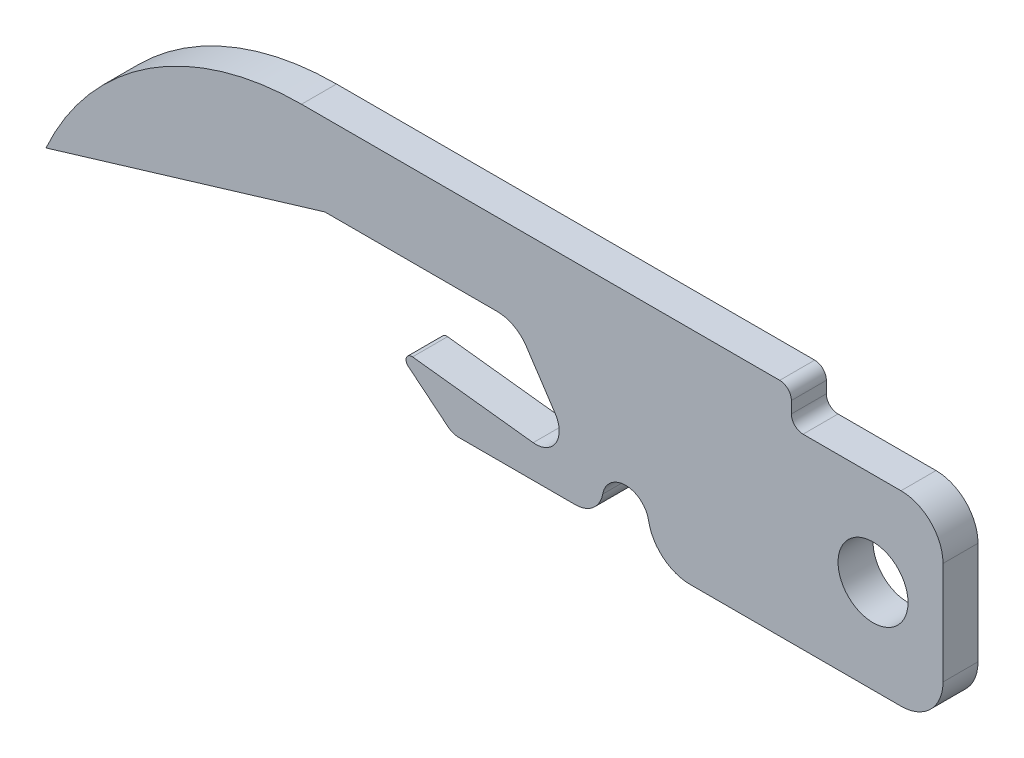
ISO-10303-21;
HEADER;
FILE_DESCRIPTION(('STEP AP214'),'2;1');
FILE_NAME('part.step','',(''),(''),'','','');
FILE_SCHEMA(('AUTOMOTIVE_DESIGN { 1 0 10303 214 1 1 1 1 }'));
ENDSEC;
DATA;
#1=APPLICATION_CONTEXT('core data for automotive mechanical design processes');
#2=APPLICATION_PROTOCOL_DEFINITION('international standard','automotive_design',2000,#1);
#3=PRODUCT_CONTEXT('',#1,'mechanical');
#4=PRODUCT('Part','Part','',(#3));
#5=PRODUCT_RELATED_PRODUCT_CATEGORY('part','',(#4));
#6=PRODUCT_DEFINITION_FORMATION('','',#4);
#7=PRODUCT_DEFINITION_CONTEXT('part definition',#1,'design');
#8=PRODUCT_DEFINITION('design','',#6,#7);
#9=PRODUCT_DEFINITION_SHAPE('','',#8);
#10=(LENGTH_UNIT() NAMED_UNIT(*) SI_UNIT(.MILLI.,.METRE.));
#11=(NAMED_UNIT(*) PLANE_ANGLE_UNIT() SI_UNIT($,.RADIAN.));
#12=(NAMED_UNIT(*) SI_UNIT($,.STERADIAN.) SOLID_ANGLE_UNIT());
#13=UNCERTAINTY_MEASURE_WITH_UNIT(LENGTH_MEASURE(1.E-05),#10,'distance_accuracy_value','');
#14=(GEOMETRIC_REPRESENTATION_CONTEXT(3) GLOBAL_UNCERTAINTY_ASSIGNED_CONTEXT((#13)) GLOBAL_UNIT_ASSIGNED_CONTEXT((#10,
#11,#12)) REPRESENTATION_CONTEXT('',''));
#15=CARTESIAN_POINT('',(0.,0.,0.));
#16=DIRECTION('',(0.,0.,1.));
#17=DIRECTION('',(1.,0.,0.));
#18=AXIS2_PLACEMENT_3D('',#15,#16,#17);
#19=CARTESIAN_POINT('',(0.494880788936604,4.26557798723639,0.75));
#20=DIRECTION('',(-0.115244285570749,-0.993337180741407,0.));
#21=DIRECTION('',(0.993337180741408,-0.115244285570749,0.));
#22=AXIS2_PLACEMENT_3D('',#19,#20,#21);
#23=PLANE('',#22);
#24=DIRECTION('',(-0.993337180741408,0.115244285570749,0.));
#25=VECTOR('',#24,1.);
#26=CARTESIAN_POINT('',(0.494880788936604,4.26557798723639,-0.75));
#27=LINE('',#26,#25);
#28=CARTESIAN_POINT('',(20.8847557144293,1.9,-0.75));
#29=VERTEX_POINT('',#28);
#30=CARTESIAN_POINT('',(15.7131126651177,2.5,-0.75));
#31=VERTEX_POINT('',#30);
#32=EDGE_CURVE('E220',#29,#31,#27,.T.);
#33=ORIENTED_EDGE('',*,*,#32,.T.);
#34=DIRECTION('',(0.,0.,-1.));
#35=VECTOR('',#34,1.);
#36=CARTESIAN_POINT('',(15.7131126651177,2.5,0.75));
#37=LINE('',#36,#35);
#38=CARTESIAN_POINT('',(15.7131126651177,2.5,0.75));
#39=VERTEX_POINT('',#38);
#40=EDGE_CURVE('E202',#39,#31,#37,.T.);
#41=ORIENTED_EDGE('',*,*,#40,.F.);
#42=DIRECTION('',(-0.993337180741408,0.115244285570749,0.));
#43=VECTOR('',#42,1.);
#44=CARTESIAN_POINT('',(0.494880788936604,4.26557798723639,0.75));
#45=LINE('',#44,#43);
#46=CARTESIAN_POINT('',(20.8847557144293,1.9,0.75));
#47=VERTEX_POINT('',#46);
#48=EDGE_CURVE('E208',#47,#39,#45,.T.);
#49=ORIENTED_EDGE('',*,*,#48,.F.);
#50=DIRECTION('',(0.,0.,-1.));
#51=VECTOR('',#50,1.);
#52=CARTESIAN_POINT('',(20.8847557144293,1.9,0.75));
#53=LINE('',#52,#51);
#54=EDGE_CURVE('E295',#47,#29,#53,.T.);
#55=ORIENTED_EDGE('',*,*,#54,.T.);
#56=EDGE_LOOP('',(#33,#41,#49,#55));
#57=FACE_BOUND('',#56,.T.);
#58=ADVANCED_FACE('F39',(#57),#23,.F.);
#59=CARTESIAN_POINT('',(15.684301593725,2.25166570481465,0.75));
#60=DIRECTION('',(0.,0.,-1.));
#61=DIRECTION('',(-1.,0.,0.));
#62=AXIS2_PLACEMENT_3D('',#59,#60,#61);
#63=CYLINDRICAL_SURFACE('',#62,0.25);
#64=CARTESIAN_POINT('',(15.684301593725,2.25166570481465,-0.75));
#65=DIRECTION('',(0.,0.,1.));
#66=DIRECTION('',(1.,0.,0.));
#67=AXIS2_PLACEMENT_3D('',#64,#65,#66);
#68=CIRCLE('',#67,0.25);
#69=CARTESIAN_POINT('',(15.5263961663952,2.05784652098655,-0.75));
#70=VERTEX_POINT('',#69);
#71=EDGE_CURVE('E344',#31,#70,#68,.T.);
#72=ORIENTED_EDGE('',*,*,#71,.T.);
#73=DIRECTION('',(0.,0.,-1.));
#74=VECTOR('',#73,1.);
#75=CARTESIAN_POINT('',(15.5263961663952,2.05784652098655,0.75));
#76=LINE('',#75,#74);
#77=CARTESIAN_POINT('',(15.5263961663952,2.05784652098655,0.75));
#78=VERTEX_POINT('',#77);
#79=EDGE_CURVE('E204',#78,#70,#76,.T.);
#80=ORIENTED_EDGE('',*,*,#79,.F.);
#81=CARTESIAN_POINT('',(15.684301593725,2.25166570481465,0.75));
#82=DIRECTION('',(0.,0.,1.));
#83=DIRECTION('',(1.,0.,0.));
#84=AXIS2_PLACEMENT_3D('',#81,#82,#83);
#85=CIRCLE('',#84,0.25);
#86=EDGE_CURVE('E197',#39,#78,#85,.T.);
#87=ORIENTED_EDGE('',*,*,#86,.F.);
#88=ORIENTED_EDGE('',*,*,#40,.T.);
#89=EDGE_LOOP('',(#72,#80,#87,#88));
#90=FACE_BOUND('',#89,.T.);
#91=ADVANCED_FACE('F200',(#90),#63,.T.);
#92=CARTESIAN_POINT('',(7.20188300308704,8.83986769351718,0.75));
#93=DIRECTION('',(-0.631621709319232,-0.775276735312399,0.));
#94=DIRECTION('',(0.775276735312399,-0.631621709319232,0.));
#95=AXIS2_PLACEMENT_3D('',#92,#93,#94);
#96=PLANE('',#95);
#97=DIRECTION('',(-0.775276735312399,0.631621709319232,0.));
#98=VECTOR('',#97,1.);
#99=CARTESIAN_POINT('',(7.20188300308704,8.83986769351718,-0.75));
#100=LINE('',#99,#98);
#101=CARTESIAN_POINT('',(17.2316813232691,0.668542448515701,-0.75));
#102=VERTEX_POINT('',#101);
#103=EDGE_CURVE('E342',#102,#70,#100,.T.);
#104=ORIENTED_EDGE('',*,*,#103,.F.);
#105=DIRECTION('',(0.,0.,-1.));
#106=VECTOR('',#105,1.);
#107=CARTESIAN_POINT('',(17.2316813232691,0.668542448515701,0.75));
#108=LINE('',#107,#106);
#109=CARTESIAN_POINT('',(17.2316813232691,0.668542448515701,0.75));
#110=VERTEX_POINT('',#109);
#111=EDGE_CURVE('E225',#110,#102,#108,.T.);
#112=ORIENTED_EDGE('',*,*,#111,.F.);
#113=DIRECTION('',(-0.775276735312399,0.631621709319232,0.));
#114=VECTOR('',#113,1.);
#115=CARTESIAN_POINT('',(7.20188300308704,8.83986769351718,0.75));
#116=LINE('',#115,#114);
#117=EDGE_CURVE('E207',#110,#78,#116,.T.);
#118=ORIENTED_EDGE('',*,*,#117,.T.);
#119=ORIENTED_EDGE('',*,*,#79,.T.);
#120=EDGE_LOOP('',(#104,#112,#118,#119));
#121=FACE_BOUND('',#120,.T.);
#122=ADVANCED_FACE('F343',(#121),#96,.T.);
#123=CARTESIAN_POINT('',(17.7053976052585,1.25,0.75));
#124=DIRECTION('',(0.,0.,-1.));
#125=DIRECTION('',(-1.,0.,0.));
#126=AXIS2_PLACEMENT_3D('',#123,#124,#125);
#127=CYLINDRICAL_SURFACE('',#126,0.75);
#128=CARTESIAN_POINT('',(17.7053976052585,1.25,-0.75));
#129=DIRECTION('',(0.,0.,1.));
#130=DIRECTION('',(1.,0.,0.));
#131=AXIS2_PLACEMENT_3D('',#128,#129,#130);
#132=CIRCLE('',#131,0.75);
#133=CARTESIAN_POINT('',(17.7053976052585,0.5,-0.75));
#134=VERTEX_POINT('',#133);
#135=EDGE_CURVE('E336',#134,#102,#132,.F.);
#136=ORIENTED_EDGE('',*,*,#135,.F.);
#137=DIRECTION('',(0.,0.,-1.));
#138=VECTOR('',#137,1.);
#139=CARTESIAN_POINT('',(17.7053976052585,0.5,0.75));
#140=LINE('',#139,#138);
#141=CARTESIAN_POINT('',(17.7053976052585,0.5,0.75));
#142=VERTEX_POINT('',#141);
#143=EDGE_CURVE('E329',#142,#134,#140,.T.);
#144=ORIENTED_EDGE('',*,*,#143,.F.);
#145=CARTESIAN_POINT('',(17.7053976052585,1.25,0.75));
#146=DIRECTION('',(0.,0.,1.));
#147=DIRECTION('',(1.,0.,0.));
#148=AXIS2_PLACEMENT_3D('',#145,#146,#147);
#149=CIRCLE('',#148,0.75);
#150=EDGE_CURVE('E339',#142,#110,#149,.F.);
#151=ORIENTED_EDGE('',*,*,#150,.T.);
#152=ORIENTED_EDGE('',*,*,#111,.T.);
#153=EDGE_LOOP('',(#136,#144,#151,#152));
#154=FACE_BOUND('',#153,.T.);
#155=ADVANCED_FACE('F334',(#154),#127,.T.);
#156=CARTESIAN_POINT('',(0.,0.499999999999995,0.75));
#157=DIRECTION('',(0.,-1.,0.));
#158=DIRECTION('',(1.,0.,0.));
#159=AXIS2_PLACEMENT_3D('',#156,#157,#158);
#160=PLANE('',#159);
#161=DIRECTION('',(-1.,0.,0.));
#162=VECTOR('',#161,1.);
#163=CARTESIAN_POINT('',(0.,0.499999999999995,-0.75));
#164=LINE('',#163,#162);
#165=CARTESIAN_POINT('',(22.6873607253505,0.500000000000001,-0.75));
#166=VERTEX_POINT('',#165);
#167=EDGE_CURVE('E348',#166,#134,#164,.T.);
#168=ORIENTED_EDGE('',*,*,#167,.F.);
#169=DIRECTION('',(0.,0.,-1.));
#170=VECTOR('',#169,1.);
#171=CARTESIAN_POINT('',(22.6873607253505,0.500000000000001,0.75));
#172=LINE('',#171,#170);
#173=CARTESIAN_POINT('',(22.6873607253505,0.500000000000001,0.75));
#174=VERTEX_POINT('',#173);
#175=EDGE_CURVE('E327',#174,#166,#172,.T.);
#176=ORIENTED_EDGE('',*,*,#175,.F.);
#177=DIRECTION('',(-1.,0.,0.));
#178=VECTOR('',#177,1.);
#179=CARTESIAN_POINT('',(0.,0.499999999999995,0.75));
#180=LINE('',#179,#178);
#181=EDGE_CURVE('E371',#174,#142,#180,.T.);
#182=ORIENTED_EDGE('',*,*,#181,.T.);
#183=ORIENTED_EDGE('',*,*,#143,.T.);
#184=EDGE_LOOP('',(#168,#176,#182,#183));
#185=FACE_BOUND('',#184,.T.);
#186=ADVANCED_FACE('F370',(#185),#160,.T.);
#187=CARTESIAN_POINT('',(22.6873607253505,1.69809038664018,0.75));
#188=DIRECTION('',(0.,0.,-1.));
#189=DIRECTION('',(-1.,0.,0.));
#190=AXIS2_PLACEMENT_3D('',#187,#188,#189);
#191=CYLINDRICAL_SURFACE('',#190,1.19809038664018);
#192=CARTESIAN_POINT('',(22.6873607253505,1.69809038664018,-0.75));
#193=DIRECTION('',(0.,0.,1.));
#194=DIRECTION('',(1.,0.,0.));
#195=AXIS2_PLACEMENT_3D('',#192,#193,#194);
#196=CIRCLE('',#195,1.19809038664018);
#197=CARTESIAN_POINT('',(23.8656386842985,1.48110737804949,-0.75));
#198=VERTEX_POINT('',#197);
#199=EDGE_CURVE('E350',#166,#198,#196,.T.);
#200=ORIENTED_EDGE('',*,*,#199,.T.);
#201=DIRECTION('',(0.,0.,-1.));
#202=VECTOR('',#201,1.);
#203=CARTESIAN_POINT('',(23.8656386842985,1.48110737804949,0.75));
#204=LINE('',#203,#202);
#205=CARTESIAN_POINT('',(23.8656386842985,1.48110737804949,0.75));
#206=VERTEX_POINT('',#205);
#207=EDGE_CURVE('E325',#206,#198,#204,.T.);
#208=ORIENTED_EDGE('',*,*,#207,.F.);
#209=CARTESIAN_POINT('',(22.6873607253505,1.69809038664018,0.75));
#210=DIRECTION('',(0.,0.,1.));
#211=DIRECTION('',(1.,0.,0.));
#212=AXIS2_PLACEMENT_3D('',#209,#210,#211);
#213=CIRCLE('',#212,1.19809038664018);
#214=EDGE_CURVE('E366',#174,#206,#213,.T.);
#215=ORIENTED_EDGE('',*,*,#214,.F.);
#216=ORIENTED_EDGE('',*,*,#175,.T.);
#217=EDGE_LOOP('',(#200,#208,#215,#216));
#218=FACE_BOUND('',#217,.T.);
#219=ADVANCED_FACE('F365',(#218),#191,.T.);
#220=CARTESIAN_POINT('',(24.8491020123469,1.3,0.75));
#221=DIRECTION('',(0.,0.,-1.));
#222=DIRECTION('',(-1.,0.,0.));
#223=AXIS2_PLACEMENT_3D('',#220,#221,#222);
#224=CYLINDRICAL_SURFACE('',#223,1.);
#225=CARTESIAN_POINT('',(24.8491020123469,1.3,-0.75));
#226=DIRECTION('',(0.,0.,1.));
#227=DIRECTION('',(1.,0.,0.));
#228=AXIS2_PLACEMENT_3D('',#225,#226,#227);
#229=CIRCLE('',#228,1.);
#230=CARTESIAN_POINT('',(25.8325653403953,1.48110737804949,-0.75));
#231=VERTEX_POINT('',#230);
#232=EDGE_CURVE('E265',#231,#198,#229,.T.);
#233=ORIENTED_EDGE('',*,*,#232,.F.);
#234=DIRECTION('',(0.,0.,-1.));
#235=VECTOR('',#234,1.);
#236=CARTESIAN_POINT('',(25.8325653403953,1.48110737804949,0.75));
#237=LINE('',#236,#235);
#238=CARTESIAN_POINT('',(25.8325653403953,1.48110737804949,0.75));
#239=VERTEX_POINT('',#238);
#240=EDGE_CURVE('E323',#239,#231,#237,.T.);
#241=ORIENTED_EDGE('',*,*,#240,.F.);
#242=CARTESIAN_POINT('',(24.8491020123469,1.3,0.75));
#243=DIRECTION('',(0.,0.,1.));
#244=DIRECTION('',(1.,0.,0.));
#245=AXIS2_PLACEMENT_3D('',#242,#243,#244);
#246=CIRCLE('',#245,1.);
#247=EDGE_CURVE('E362',#239,#206,#246,.T.);
#248=ORIENTED_EDGE('',*,*,#247,.T.);
#249=ORIENTED_EDGE('',*,*,#207,.T.);
#250=EDGE_LOOP('',(#233,#241,#248,#249));
#251=FACE_BOUND('',#250,.T.);
#252=ADVANCED_FACE('F358',(#251),#224,.F.);
#253=CARTESIAN_POINT('',(27.6113269901755,1.80867104959578,0.75));
#254=DIRECTION('',(0.,0.,-1.));
#255=DIRECTION('',(-1.,0.,0.));
#256=AXIS2_PLACEMENT_3D('',#253,#254,#255);
#257=CYLINDRICAL_SURFACE('',#256,1.80867104959578);
#258=CARTESIAN_POINT('',(27.6113269901755,1.80867104959578,-0.75));
#259=DIRECTION('',(0.,0.,1.));
#260=DIRECTION('',(1.,0.,0.));
#261=AXIS2_PLACEMENT_3D('',#258,#259,#260);
#262=CIRCLE('',#261,1.80867104959578);
#263=CARTESIAN_POINT('',(27.6113269901755,0.,-0.75));
#264=VERTEX_POINT('',#263);
#265=EDGE_CURVE('E261',#264,#231,#262,.F.);
#266=ORIENTED_EDGE('',*,*,#265,.F.);
#267=DIRECTION('',(0.,0.,-1.));
#268=VECTOR('',#267,1.);
#269=CARTESIAN_POINT('',(27.6113269901755,0.,0.75));
#270=LINE('',#269,#268);
#271=CARTESIAN_POINT('',(27.6113269901755,0.,0.75));
#272=VERTEX_POINT('',#271);
#273=EDGE_CURVE('E259',#272,#264,#270,.T.);
#274=ORIENTED_EDGE('',*,*,#273,.F.);
#275=CARTESIAN_POINT('',(27.6113269901755,1.80867104959578,0.75));
#276=DIRECTION('',(0.,0.,1.));
#277=DIRECTION('',(1.,0.,0.));
#278=AXIS2_PLACEMENT_3D('',#275,#276,#277);
#279=CIRCLE('',#278,1.80867104959578);
#280=EDGE_CURVE('E378',#272,#239,#279,.F.);
#281=ORIENTED_EDGE('',*,*,#280,.T.);
#282=ORIENTED_EDGE('',*,*,#240,.T.);
#283=EDGE_LOOP('',(#266,#274,#281,#282));
#284=FACE_BOUND('',#283,.T.);
#285=ADVANCED_FACE('F514',(#284),#257,.T.);
#286=CARTESIAN_POINT('',(0.,0.,0.75));
#287=DIRECTION('',(0.,-1.,0.));
#288=DIRECTION('',(1.,0.,0.));
#289=AXIS2_PLACEMENT_3D('',#286,#287,#288);
#290=PLANE('',#289);
#291=DIRECTION('',(-1.,0.,0.));
#292=VECTOR('',#291,1.);
#293=CARTESIAN_POINT('',(0.,0.,-0.75));
#294=LINE('',#293,#292);
#295=CARTESIAN_POINT('',(36.6539947051293,0.,-0.75));
#296=VERTEX_POINT('',#295);
#297=EDGE_CURVE('E254',#296,#264,#294,.T.);
#298=ORIENTED_EDGE('',*,*,#297,.F.);
#299=DIRECTION('',(0.,0.,-1.));
#300=VECTOR('',#299,1.);
#301=CARTESIAN_POINT('',(36.6539947051293,0.,0.75));
#302=LINE('',#301,#300);
#303=CARTESIAN_POINT('',(36.6539947051293,0.,0.75));
#304=VERTEX_POINT('',#303);
#305=EDGE_CURVE('E62',#296,#304,#302,.F.);
#306=ORIENTED_EDGE('',*,*,#305,.T.);
#307=DIRECTION('',(-1.,0.,0.));
#308=VECTOR('',#307,1.);
#309=CARTESIAN_POINT('',(0.,0.,0.75));
#310=LINE('',#309,#308);
#311=EDGE_CURVE('E240',#304,#272,#310,.T.);
#312=ORIENTED_EDGE('',*,*,#311,.T.);
#313=ORIENTED_EDGE('',*,*,#273,.T.);
#314=EDGE_LOOP('',(#298,#306,#312,#313));
#315=FACE_BOUND('',#314,.T.);
#316=ADVANCED_FACE('F257',(#315),#290,.T.);
#317=CARTESIAN_POINT('',(38.4539947051293,0.,0.75));
#318=DIRECTION('',(1.,0.,0.));
#319=DIRECTION('',(0.,0.,-1.));
#320=AXIS2_PLACEMENT_3D('',#317,#318,#319);
#321=PLANE('',#320);
#322=DIRECTION('',(0.,-1.,0.));
#323=VECTOR('',#322,1.);
#324=CARTESIAN_POINT('',(38.4539947051293,0.,0.75));
#325=LINE('',#324,#323);
#326=CARTESIAN_POINT('',(38.4539947051293,6.2,0.75));
#327=VERTEX_POINT('',#326);
#328=CARTESIAN_POINT('',(38.4539947051293,1.79999999999999,0.75));
#329=VERTEX_POINT('',#328);
#330=EDGE_CURVE('E238',#327,#329,#325,.T.);
#331=ORIENTED_EDGE('',*,*,#330,.T.);
#332=DIRECTION('',(0.,0.,-1.));
#333=VECTOR('',#332,1.);
#334=CARTESIAN_POINT('',(38.4539947051293,1.79999999999999,0.75));
#335=LINE('',#334,#333);
#336=CARTESIAN_POINT('',(38.4539947051293,1.79999999999999,-0.75));
#337=VERTEX_POINT('',#336);
#338=EDGE_CURVE('E223',#329,#337,#335,.T.);
#339=ORIENTED_EDGE('',*,*,#338,.T.);
#340=DIRECTION('',(0.,-1.,0.));
#341=VECTOR('',#340,1.);
#342=CARTESIAN_POINT('',(38.4539947051293,0.,-0.75));
#343=LINE('',#342,#341);
#344=CARTESIAN_POINT('',(38.4539947051293,6.2,-0.75));
#345=VERTEX_POINT('',#344);
#346=EDGE_CURVE('E256',#345,#337,#343,.T.);
#347=ORIENTED_EDGE('',*,*,#346,.F.);
#348=DIRECTION('',(0.,0.,-1.));
#349=VECTOR('',#348,1.);
#350=CARTESIAN_POINT('',(38.4539947051293,6.2,0.75));
#351=LINE('',#350,#349);
#352=EDGE_CURVE('E221',#345,#327,#351,.F.);
#353=ORIENTED_EDGE('',*,*,#352,.T.);
#354=EDGE_LOOP('',(#331,#339,#347,#353));
#355=FACE_BOUND('',#354,.T.);
#356=ADVANCED_FACE('F244',(#355),#321,.T.);
#357=CARTESIAN_POINT('',(0.,8.00000000000001,0.75));
#358=DIRECTION('',(0.,1.,0.));
#359=DIRECTION('',(-1.,0.,0.));
#360=AXIS2_PLACEMENT_3D('',#357,#358,#359);
#361=PLANE('',#360);
#362=DIRECTION('',(1.,0.,0.));
#363=VECTOR('',#362,1.);
#364=CARTESIAN_POINT('',(0.,8.00000000000001,0.75));
#365=LINE('',#364,#363);
#366=CARTESIAN_POINT('',(32.4539947051293,8.,0.75));
#367=VERTEX_POINT('',#366);
#368=CARTESIAN_POINT('',(36.6539947051293,8.,0.75));
#369=VERTEX_POINT('',#368);
#370=EDGE_CURVE('E248',#367,#369,#365,.T.);
#371=ORIENTED_EDGE('',*,*,#370,.T.);
#372=DIRECTION('',(0.,0.,-1.));
#373=VECTOR('',#372,1.);
#374=CARTESIAN_POINT('',(36.6539947051293,8.,0.75));
#375=LINE('',#374,#373);
#376=CARTESIAN_POINT('',(36.6539947051293,8.,-0.75));
#377=VERTEX_POINT('',#376);
#378=EDGE_CURVE('E11',#369,#377,#375,.T.);
#379=ORIENTED_EDGE('',*,*,#378,.T.);
#380=DIRECTION('',(1.,0.,0.));
#381=VECTOR('',#380,1.);
#382=CARTESIAN_POINT('',(0.,8.00000000000001,-0.75));
#383=LINE('',#382,#381);
#384=CARTESIAN_POINT('',(32.4539947051293,8.,-0.75));
#385=VERTEX_POINT('',#384);
#386=EDGE_CURVE('E263',#385,#377,#383,.T.);
#387=ORIENTED_EDGE('',*,*,#386,.F.);
#388=DIRECTION('',(0.,0.,-1.));
#389=VECTOR('',#388,1.);
#390=CARTESIAN_POINT('',(32.4539947051293,8.,0.75));
#391=LINE('',#390,#389);
#392=EDGE_CURVE('E320',#367,#385,#391,.T.);
#393=ORIENTED_EDGE('',*,*,#392,.F.);
#394=EDGE_LOOP('',(#371,#379,#387,#393));
#395=FACE_BOUND('',#394,.T.);
#396=ADVANCED_FACE('F455',(#395),#361,.T.);
#397=CARTESIAN_POINT('',(32.4539947051293,8.5,0.75));
#398=DIRECTION('',(0.,0.,-1.));
#399=DIRECTION('',(-1.,0.,0.));
#400=AXIS2_PLACEMENT_3D('',#397,#398,#399);
#401=CYLINDRICAL_SURFACE('',#400,0.5);
#402=CARTESIAN_POINT('',(32.4539947051293,8.5,-0.75));
#403=DIRECTION('',(0.,0.,1.));
#404=DIRECTION('',(1.,0.,0.));
#405=AXIS2_PLACEMENT_3D('',#402,#403,#404);
#406=CIRCLE('',#405,0.5);
#407=CARTESIAN_POINT('',(31.9539947051293,8.5,-0.75));
#408=VERTEX_POINT('',#407);
#409=EDGE_CURVE('E271',#385,#408,#406,.F.);
#410=ORIENTED_EDGE('',*,*,#409,.T.);
#411=DIRECTION('',(0.,0.,-1.));
#412=VECTOR('',#411,1.);
#413=CARTESIAN_POINT('',(31.9539947051293,8.5,0.75));
#414=LINE('',#413,#412);
#415=CARTESIAN_POINT('',(31.9539947051293,8.5,0.75));
#416=VERTEX_POINT('',#415);
#417=EDGE_CURVE('E318',#416,#408,#414,.T.);
#418=ORIENTED_EDGE('',*,*,#417,.F.);
#419=CARTESIAN_POINT('',(32.4539947051293,8.5,0.75));
#420=DIRECTION('',(0.,0.,1.));
#421=DIRECTION('',(1.,0.,0.));
#422=AXIS2_PLACEMENT_3D('',#419,#420,#421);
#423=CIRCLE('',#422,0.5);
#424=EDGE_CURVE('E383',#367,#416,#423,.F.);
#425=ORIENTED_EDGE('',*,*,#424,.F.);
#426=ORIENTED_EDGE('',*,*,#392,.T.);
#427=EDGE_LOOP('',(#410,#418,#425,#426));
#428=FACE_BOUND('',#427,.T.);
#429=ADVANCED_FACE('F452',(#428),#401,.F.);
#430=CARTESIAN_POINT('',(31.9539947051293,0.,0.75));
#431=DIRECTION('',(1.,0.,0.));
#432=DIRECTION('',(0.,0.,-1.));
#433=AXIS2_PLACEMENT_3D('',#430,#431,#432);
#434=PLANE('',#433);
#435=DIRECTION('',(0.,-1.,0.));
#436=VECTOR('',#435,1.);
#437=CARTESIAN_POINT('',(31.9539947051293,0.,-0.75));
#438=LINE('',#437,#436);
#439=CARTESIAN_POINT('',(31.9539947051293,9.,-0.75));
#440=VERTEX_POINT('',#439);
#441=EDGE_CURVE('E274',#440,#408,#438,.T.);
#442=ORIENTED_EDGE('',*,*,#441,.F.);
#443=DIRECTION('',(0.,0.,-1.));
#444=VECTOR('',#443,1.);
#445=CARTESIAN_POINT('',(31.9539947051293,9.,0.75));
#446=LINE('',#445,#444);
#447=CARTESIAN_POINT('',(31.9539947051293,9.,0.75));
#448=VERTEX_POINT('',#447);
#449=EDGE_CURVE('E316',#448,#440,#446,.T.);
#450=ORIENTED_EDGE('',*,*,#449,.F.);
#451=DIRECTION('',(0.,-1.,0.));
#452=VECTOR('',#451,1.);
#453=CARTESIAN_POINT('',(31.9539947051293,0.,0.75));
#454=LINE('',#453,#452);
#455=EDGE_CURVE('E385',#448,#416,#454,.T.);
#456=ORIENTED_EDGE('',*,*,#455,.T.);
#457=ORIENTED_EDGE('',*,*,#417,.T.);
#458=EDGE_LOOP('',(#442,#450,#456,#457));
#459=FACE_BOUND('',#458,.T.);
#460=ADVANCED_FACE('F447',(#459),#434,.T.);
#461=CARTESIAN_POINT('',(31.4539947051293,9.,0.75));
#462=DIRECTION('',(0.,0.,-1.));
#463=DIRECTION('',(-1.,0.,0.));
#464=AXIS2_PLACEMENT_3D('',#461,#462,#463);
#465=CYLINDRICAL_SURFACE('',#464,0.500000000000001);
#466=CARTESIAN_POINT('',(31.4539947051293,9.,-0.75));
#467=DIRECTION('',(0.,0.,1.));
#468=DIRECTION('',(1.,0.,0.));
#469=AXIS2_PLACEMENT_3D('',#466,#467,#468);
#470=CIRCLE('',#469,0.500000000000001);
#471=CARTESIAN_POINT('',(31.4539947051293,9.5,-0.75));
#472=VERTEX_POINT('',#471);
#473=EDGE_CURVE('E277',#440,#472,#470,.T.);
#474=ORIENTED_EDGE('',*,*,#473,.T.);
#475=DIRECTION('',(0.,0.,-1.));
#476=VECTOR('',#475,1.);
#477=CARTESIAN_POINT('',(31.4539947051293,9.5,0.75));
#478=LINE('',#477,#476);
#479=CARTESIAN_POINT('',(31.4539947051293,9.5,0.75));
#480=VERTEX_POINT('',#479);
#481=EDGE_CURVE('E314',#480,#472,#478,.T.);
#482=ORIENTED_EDGE('',*,*,#481,.F.);
#483=CARTESIAN_POINT('',(31.4539947051293,9.,0.75));
#484=DIRECTION('',(0.,0.,1.));
#485=DIRECTION('',(1.,0.,0.));
#486=AXIS2_PLACEMENT_3D('',#483,#484,#485);
#487=CIRCLE('',#486,0.500000000000001);
#488=EDGE_CURVE('E388',#448,#480,#487,.T.);
#489=ORIENTED_EDGE('',*,*,#488,.F.);
#490=ORIENTED_EDGE('',*,*,#449,.T.);
#491=EDGE_LOOP('',(#474,#482,#489,#490));
#492=FACE_BOUND('',#491,.T.);
#493=ADVANCED_FACE('F443',(#492),#465,.T.);
#494=CARTESIAN_POINT('',(0.,9.49999999999999,0.75));
#495=DIRECTION('',(0.,1.,0.));
#496=DIRECTION('',(-1.,0.,0.));
#497=AXIS2_PLACEMENT_3D('',#494,#495,#496);
#498=PLANE('',#497);
#499=DIRECTION('',(1.,0.,0.));
#500=VECTOR('',#499,1.);
#501=CARTESIAN_POINT('',(0.,9.49999999999999,-0.75));
#502=LINE('',#501,#500);
#503=CARTESIAN_POINT('',(10.9539947051293,9.5,-0.75));
#504=VERTEX_POINT('',#503);
#505=EDGE_CURVE('E280',#504,#472,#502,.T.);
#506=ORIENTED_EDGE('',*,*,#505,.F.);
#507=DIRECTION('',(0.,0.,-1.));
#508=VECTOR('',#507,1.);
#509=CARTESIAN_POINT('',(10.9539947051293,9.5,0.75));
#510=LINE('',#509,#508);
#511=CARTESIAN_POINT('',(10.9539947051293,9.5,0.75));
#512=VERTEX_POINT('',#511);
#513=EDGE_CURVE('E312',#512,#504,#510,.T.);
#514=ORIENTED_EDGE('',*,*,#513,.F.);
#515=DIRECTION('',(1.,0.,0.));
#516=VECTOR('',#515,1.);
#517=CARTESIAN_POINT('',(0.,9.49999999999999,0.75));
#518=LINE('',#517,#516);
#519=EDGE_CURVE('E390',#512,#480,#518,.T.);
#520=ORIENTED_EDGE('',*,*,#519,.T.);
#521=ORIENTED_EDGE('',*,*,#481,.T.);
#522=EDGE_LOOP('',(#506,#514,#520,#521));
#523=FACE_BOUND('',#522,.T.);
#524=ADVANCED_FACE('F439',(#523),#498,.T.);
#525=CARTESIAN_POINT('',(10.9539947051293,-2.5,0.75));
#526=DIRECTION('',(0.,0.,-1.));
#527=DIRECTION('',(-1.,0.,0.));
#528=AXIS2_PLACEMENT_3D('',#525,#526,#527);
#529=CYLINDRICAL_SURFACE('',#528,12.);
#530=CARTESIAN_POINT('',(10.9539947051293,-2.5,-0.75));
#531=DIRECTION('',(0.,0.,1.));
#532=DIRECTION('',(1.,0.,0.));
#533=AXIS2_PLACEMENT_3D('',#530,#531,#532);
#534=CIRCLE('',#533,12.);
#535=CARTESIAN_POINT('',(0.,2.4,-0.75));
#536=VERTEX_POINT('',#535);
#537=EDGE_CURVE('E283',#504,#536,#534,.T.);
#538=ORIENTED_EDGE('',*,*,#537,.T.);
#539=DIRECTION('',(0.,0.,-1.));
#540=VECTOR('',#539,1.);
#541=CARTESIAN_POINT('',(0.,2.4,0.75));
#542=LINE('',#541,#540);
#543=CARTESIAN_POINT('',(0.,2.4,0.75));
#544=VERTEX_POINT('',#543);
#545=EDGE_CURVE('E309',#544,#536,#542,.T.);
#546=ORIENTED_EDGE('',*,*,#545,.F.);
#547=CARTESIAN_POINT('',(10.9539947051293,-2.5,0.75));
#548=DIRECTION('',(0.,0.,1.));
#549=DIRECTION('',(1.,0.,0.));
#550=AXIS2_PLACEMENT_3D('',#547,#548,#549);
#551=CIRCLE('',#550,12.);
#552=EDGE_CURVE('E393',#512,#544,#551,.T.);
#553=ORIENTED_EDGE('',*,*,#552,.F.);
#554=ORIENTED_EDGE('',*,*,#513,.T.);
#555=EDGE_LOOP('',(#538,#546,#553,#554));
#556=FACE_BOUND('',#555,.T.);
#557=ADVANCED_FACE('F434',(#556),#529,.T.);
#558=CARTESIAN_POINT('',(-0.662670644239164,2.20043371457766,0.75));
#559=DIRECTION('',(-0.288361958180991,0.957521478126744,0.));
#560=DIRECTION('',(-0.957521478126744,-0.288361958180991,0.));
#561=AXIS2_PLACEMENT_3D('',#558,#559,#560);
#562=PLANE('',#561);
#563=DIRECTION('',(0.957521478126744,0.288361958180991,0.));
#564=VECTOR('',#563,1.);
#565=CARTESIAN_POINT('',(-0.662670644239164,2.20043371457766,-0.75));
#566=LINE('',#565,#564);
#567=CARTESIAN_POINT('',(11.9539947051293,6.,-0.75));
#568=VERTEX_POINT('',#567);
#569=EDGE_CURVE('E285',#536,#568,#566,.T.);
#570=ORIENTED_EDGE('',*,*,#569,.T.);
#571=DIRECTION('',(0.,0.,-1.));
#572=VECTOR('',#571,1.);
#573=CARTESIAN_POINT('',(11.9539947051293,6.,0.75));
#574=LINE('',#573,#572);
#575=CARTESIAN_POINT('',(11.9539947051293,6.,0.75));
#576=VERTEX_POINT('',#575);
#577=EDGE_CURVE('E306',#576,#568,#574,.T.);
#578=ORIENTED_EDGE('',*,*,#577,.F.);
#579=DIRECTION('',(0.957521478126744,0.288361958180991,0.));
#580=VECTOR('',#579,1.);
#581=CARTESIAN_POINT('',(-0.662670644239164,2.20043371457766,0.75));
#582=LINE('',#581,#580);
#583=EDGE_CURVE('E395',#544,#576,#582,.T.);
#584=ORIENTED_EDGE('',*,*,#583,.F.);
#585=ORIENTED_EDGE('',*,*,#545,.T.);
#586=EDGE_LOOP('',(#570,#578,#584,#585));
#587=FACE_BOUND('',#586,.T.);
#588=ADVANCED_FACE('F430',(#587),#562,.F.);
#589=CARTESIAN_POINT('',(0.,6.,0.75));
#590=DIRECTION('',(0.,1.,0.));
#591=DIRECTION('',(-1.,0.,0.));
#592=AXIS2_PLACEMENT_3D('',#589,#590,#591);
#593=PLANE('',#592);
#594=DIRECTION('',(1.,0.,0.));
#595=VECTOR('',#594,1.);
#596=CARTESIAN_POINT('',(0.,6.,-0.75));
#597=LINE('',#596,#595);
#598=CARTESIAN_POINT('',(19.342631878033,6.,-0.75));
#599=VERTEX_POINT('',#598);
#600=EDGE_CURVE('E287',#568,#599,#597,.T.);
#601=ORIENTED_EDGE('',*,*,#600,.T.);
#602=DIRECTION('',(0.,0.,-1.));
#603=VECTOR('',#602,1.);
#604=CARTESIAN_POINT('',(19.342631878033,6.,0.75));
#605=LINE('',#604,#603);
#606=CARTESIAN_POINT('',(19.342631878033,6.,0.75));
#607=VERTEX_POINT('',#606);
#608=EDGE_CURVE('E303',#607,#599,#605,.T.);
#609=ORIENTED_EDGE('',*,*,#608,.F.);
#610=DIRECTION('',(1.,0.,0.));
#611=VECTOR('',#610,1.);
#612=CARTESIAN_POINT('',(0.,6.,0.75));
#613=LINE('',#612,#611);
#614=EDGE_CURVE('E397',#576,#607,#613,.T.);
#615=ORIENTED_EDGE('',*,*,#614,.F.);
#616=ORIENTED_EDGE('',*,*,#577,.T.);
#617=EDGE_LOOP('',(#601,#609,#615,#616));
#618=FACE_BOUND('',#617,.T.);
#619=ADVANCED_FACE('F425',(#618),#593,.F.);
#620=CARTESIAN_POINT('',(19.342631878033,4.5,0.75));
#621=DIRECTION('',(0.,0.,-1.));
#622=DIRECTION('',(-1.,0.,0.));
#623=AXIS2_PLACEMENT_3D('',#620,#621,#622);
#624=CYLINDRICAL_SURFACE('',#623,1.5);
#625=CARTESIAN_POINT('',(19.342631878033,4.5,-0.75));
#626=DIRECTION('',(0.,0.,1.));
#627=DIRECTION('',(1.,0.,0.));
#628=AXIS2_PLACEMENT_3D('',#625,#626,#627);
#629=CIRCLE('',#628,1.5);
#630=CARTESIAN_POINT('',(20.5951918475762,5.32528390430085,-0.75));
#631=VERTEX_POINT('',#630);
#632=EDGE_CURVE('E289',#599,#631,#629,.F.);
#633=ORIENTED_EDGE('',*,*,#632,.T.);
#634=DIRECTION('',(0.,0.,-1.));
#635=VECTOR('',#634,1.);
#636=CARTESIAN_POINT('',(20.5951918475762,5.32528390430085,0.75));
#637=LINE('',#636,#635);
#638=CARTESIAN_POINT('',(20.5951918475762,5.32528390430085,0.75));
#639=VERTEX_POINT('',#638);
#640=EDGE_CURVE('E300',#639,#631,#637,.T.);
#641=ORIENTED_EDGE('',*,*,#640,.F.);
#642=CARTESIAN_POINT('',(19.342631878033,4.5,0.75));
#643=DIRECTION('',(0.,0.,1.));
#644=DIRECTION('',(1.,0.,0.));
#645=AXIS2_PLACEMENT_3D('',#642,#643,#644);
#646=CIRCLE('',#645,1.5);
#647=EDGE_CURVE('E399',#607,#639,#646,.F.);
#648=ORIENTED_EDGE('',*,*,#647,.F.);
#649=ORIENTED_EDGE('',*,*,#608,.T.);
#650=EDGE_LOOP('',(#633,#641,#648,#649));
#651=FACE_BOUND('',#650,.T.);
#652=ADVANCED_FACE('F419',(#651),#624,.F.);
#653=CARTESIAN_POINT('',(16.80745310762,11.0740570186586,0.75));
#654=DIRECTION('',(0.835039979695436,0.5501892695339,0.));
#655=DIRECTION('',(-0.5501892695339,0.835039979695436,0.));
#656=AXIS2_PLACEMENT_3D('',#653,#654,#655);
#657=PLANE('',#656);
#658=DIRECTION('',(0.5501892695339,-0.835039979695436,0.));
#659=VECTOR('',#658,1.);
#660=CARTESIAN_POINT('',(16.80745310762,11.0740570186586,-0.75));
#661=LINE('',#660,#659);
#662=CARTESIAN_POINT('',(21.8350399796954,3.44352645027531,-0.75));
#663=VERTEX_POINT('',#662);
#664=EDGE_CURVE('E291',#631,#663,#661,.T.);
#665=ORIENTED_EDGE('',*,*,#664,.T.);
#666=DIRECTION('',(0.,0.,-1.));
#667=VECTOR('',#666,1.);
#668=CARTESIAN_POINT('',(21.8350399796954,3.44352645027531,0.75));
#669=LINE('',#668,#667);
#670=CARTESIAN_POINT('',(21.8350399796954,3.44352645027531,0.75));
#671=VERTEX_POINT('',#670);
#672=EDGE_CURVE('E297',#671,#663,#669,.T.);
#673=ORIENTED_EDGE('',*,*,#672,.F.);
#674=DIRECTION('',(0.5501892695339,-0.835039979695436,0.));
#675=VECTOR('',#674,1.);
#676=CARTESIAN_POINT('',(16.80745310762,11.0740570186586,0.75));
#677=LINE('',#676,#675);
#678=EDGE_CURVE('E401',#639,#671,#677,.T.);
#679=ORIENTED_EDGE('',*,*,#678,.F.);
#680=ORIENTED_EDGE('',*,*,#640,.T.);
#681=EDGE_LOOP('',(#665,#673,#679,#680));
#682=FACE_BOUND('',#681,.T.);
#683=ADVANCED_FACE('F415',(#682),#657,.F.);
#684=CARTESIAN_POINT('',(35.4539947051293,4.,0.75));
#685=DIRECTION('',(0.,0.,-1.));
#686=DIRECTION('',(-1.,0.,0.));
#687=AXIS2_PLACEMENT_3D('',#684,#685,#686);
#688=CYLINDRICAL_SURFACE('',#687,1.5);
#689=CARTESIAN_POINT('',(35.4539947051293,4.,0.75));
#690=DIRECTION('',(0.,0.,1.));
#691=DIRECTION('',(1.,0.,0.));
#692=AXIS2_PLACEMENT_3D('',#689,#690,#691);
#693=CIRCLE('',#692,1.5);
#694=CARTESIAN_POINT('',(36.9539947051293,4.,0.75));
#695=VERTEX_POINT('',#694);
#696=EDGE_CURVE('E217',#695,#695,#693,.T.);
#697=ORIENTED_EDGE('',*,*,#696,.T.);
#698=EDGE_LOOP('',(#697));
#699=FACE_BOUND('',#698,.T.);
#700=CARTESIAN_POINT('',(35.4539947051293,4.,-0.75));
#701=DIRECTION('',(0.,0.,1.));
#702=DIRECTION('',(1.,0.,0.));
#703=AXIS2_PLACEMENT_3D('',#700,#701,#702);
#704=CIRCLE('',#703,1.5);
#705=CARTESIAN_POINT('',(36.9539947051293,4.,-0.75));
#706=VERTEX_POINT('',#705);
#707=EDGE_CURVE('E404',#706,#706,#704,.T.);
#708=ORIENTED_EDGE('',*,*,#707,.F.);
#709=EDGE_LOOP('',(#708));
#710=FACE_BOUND('',#709,.T.);
#711=ADVANCED_FACE('F470',(#699,#710),#688,.F.);
#712=CARTESIAN_POINT('',(21.,2.89333718074141,0.75));
#713=DIRECTION('',(0.,0.,-1.));
#714=DIRECTION('',(-1.,0.,0.));
#715=AXIS2_PLACEMENT_3D('',#712,#713,#714);
#716=CYLINDRICAL_SURFACE('',#715,0.999999999999999);
#717=CARTESIAN_POINT('',(21.,2.89333718074141,-0.75));
#718=DIRECTION('',(0.,0.,1.));
#719=DIRECTION('',(1.,0.,0.));
#720=AXIS2_PLACEMENT_3D('',#717,#718,#719);
#721=CIRCLE('',#720,0.999999999999999);
#722=EDGE_CURVE('E293',#663,#29,#721,.F.);
#723=ORIENTED_EDGE('',*,*,#722,.T.);
#724=ORIENTED_EDGE('',*,*,#54,.F.);
#725=CARTESIAN_POINT('',(21.,2.89333718074141,0.75));
#726=DIRECTION('',(0.,0.,1.));
#727=DIRECTION('',(1.,0.,0.));
#728=AXIS2_PLACEMENT_3D('',#725,#726,#727);
#729=CIRCLE('',#728,0.999999999999999);
#730=EDGE_CURVE('E213',#671,#47,#729,.F.);
#731=ORIENTED_EDGE('',*,*,#730,.F.);
#732=ORIENTED_EDGE('',*,*,#672,.T.);
#733=EDGE_LOOP('',(#723,#724,#731,#732));
#734=FACE_BOUND('',#733,.T.);
#735=ADVANCED_FACE('F411',(#734),#716,.F.);
#736=CARTESIAN_POINT('',(0.,0.,0.75));
#737=DIRECTION('',(0.,0.,1.));
#738=DIRECTION('',(1.,0.,0.));
#739=AXIS2_PLACEMENT_3D('',#736,#737,#738);
#740=PLANE('',#739);
#741=ORIENTED_EDGE('',*,*,#696,.F.);
#742=EDGE_LOOP('',(#741));
#743=FACE_BOUND('',#742,.T.);
#744=ORIENTED_EDGE('',*,*,#311,.F.);
#745=CARTESIAN_POINT('',(36.6539947051293,1.79999999999999,0.75));
#746=DIRECTION('',(0.,0.,1.));
#747=DIRECTION('',(1.,0.,0.));
#748=AXIS2_PLACEMENT_3D('',#745,#746,#747);
#749=CIRCLE('',#748,1.8);
#750=EDGE_CURVE('E47',#304,#329,#749,.T.);
#751=ORIENTED_EDGE('',*,*,#750,.T.);
#752=ORIENTED_EDGE('',*,*,#330,.F.);
#753=CARTESIAN_POINT('',(36.6539947051293,6.2,0.75));
#754=DIRECTION('',(0.,0.,1.));
#755=DIRECTION('',(1.,0.,0.));
#756=AXIS2_PLACEMENT_3D('',#753,#754,#755);
#757=CIRCLE('',#756,1.8);
#758=EDGE_CURVE('E54',#327,#369,#757,.T.);
#759=ORIENTED_EDGE('',*,*,#758,.T.);
#760=ORIENTED_EDGE('',*,*,#370,.F.);
#761=ORIENTED_EDGE('',*,*,#424,.T.);
#762=ORIENTED_EDGE('',*,*,#455,.F.);
#763=ORIENTED_EDGE('',*,*,#488,.T.);
#764=ORIENTED_EDGE('',*,*,#519,.F.);
#765=ORIENTED_EDGE('',*,*,#552,.T.);
#766=ORIENTED_EDGE('',*,*,#583,.T.);
#767=ORIENTED_EDGE('',*,*,#614,.T.);
#768=ORIENTED_EDGE('',*,*,#647,.T.);
#769=ORIENTED_EDGE('',*,*,#678,.T.);
#770=ORIENTED_EDGE('',*,*,#730,.T.);
#771=ORIENTED_EDGE('',*,*,#48,.T.);
#772=ORIENTED_EDGE('',*,*,#86,.T.);
#773=ORIENTED_EDGE('',*,*,#117,.F.);
#774=ORIENTED_EDGE('',*,*,#150,.F.);
#775=ORIENTED_EDGE('',*,*,#181,.F.);
#776=ORIENTED_EDGE('',*,*,#214,.T.);
#777=ORIENTED_EDGE('',*,*,#247,.F.);
#778=ORIENTED_EDGE('',*,*,#280,.F.);
#779=EDGE_LOOP('',(#744,#751,#752,#759,#760,#761,#762,#763,#764,#765,#766,#767,#768,#769,#770,
#771,#772,#773,#774,#775,#776,#777,#778));
#780=FACE_BOUND('',#779,.T.);
#781=ADVANCED_FACE('F211',(#743,#780),#740,.T.);
#782=CARTESIAN_POINT('',(0.,0.,-0.75));
#783=DIRECTION('',(0.,0.,1.));
#784=DIRECTION('',(1.,0.,0.));
#785=AXIS2_PLACEMENT_3D('',#782,#783,#784);
#786=PLANE('',#785);
#787=ORIENTED_EDGE('',*,*,#707,.T.);
#788=EDGE_LOOP('',(#787));
#789=FACE_BOUND('',#788,.T.);
#790=ORIENTED_EDGE('',*,*,#346,.T.);
#791=CARTESIAN_POINT('',(36.6539947051293,1.79999999999999,-0.75));
#792=DIRECTION('',(0.,0.,1.));
#793=DIRECTION('',(1.,0.,0.));
#794=AXIS2_PLACEMENT_3D('',#791,#792,#793);
#795=CIRCLE('',#794,1.8);
#796=EDGE_CURVE('E233',#337,#296,#795,.F.);
#797=ORIENTED_EDGE('',*,*,#796,.T.);
#798=ORIENTED_EDGE('',*,*,#297,.T.);
#799=ORIENTED_EDGE('',*,*,#265,.T.);
#800=ORIENTED_EDGE('',*,*,#232,.T.);
#801=ORIENTED_EDGE('',*,*,#199,.F.);
#802=ORIENTED_EDGE('',*,*,#167,.T.);
#803=ORIENTED_EDGE('',*,*,#135,.T.);
#804=ORIENTED_EDGE('',*,*,#103,.T.);
#805=ORIENTED_EDGE('',*,*,#71,.F.);
#806=ORIENTED_EDGE('',*,*,#32,.F.);
#807=ORIENTED_EDGE('',*,*,#722,.F.);
#808=ORIENTED_EDGE('',*,*,#664,.F.);
#809=ORIENTED_EDGE('',*,*,#632,.F.);
#810=ORIENTED_EDGE('',*,*,#600,.F.);
#811=ORIENTED_EDGE('',*,*,#569,.F.);
#812=ORIENTED_EDGE('',*,*,#537,.F.);
#813=ORIENTED_EDGE('',*,*,#505,.T.);
#814=ORIENTED_EDGE('',*,*,#473,.F.);
#815=ORIENTED_EDGE('',*,*,#441,.T.);
#816=ORIENTED_EDGE('',*,*,#409,.F.);
#817=ORIENTED_EDGE('',*,*,#386,.T.);
#818=CARTESIAN_POINT('',(36.6539947051293,6.2,-0.75));
#819=DIRECTION('',(0.,0.,1.));
#820=DIRECTION('',(1.,0.,0.));
#821=AXIS2_PLACEMENT_3D('',#818,#819,#820);
#822=CIRCLE('',#821,1.8);
#823=EDGE_CURVE('E231',#377,#345,#822,.F.);
#824=ORIENTED_EDGE('',*,*,#823,.T.);
#825=EDGE_LOOP('',(#790,#797,#798,#799,#800,#801,#802,#803,#804,#805,#806,#807,#808,#809,#810,
#811,#812,#813,#814,#815,#816,#817,#824));
#826=FACE_BOUND('',#825,.T.);
#827=ADVANCED_FACE('F252',(#789,#826),#786,.F.);
#828=CARTESIAN_POINT('',(36.6539947051293,1.79999999999999,0.75));
#829=DIRECTION('',(0.,0.,-1.));
#830=DIRECTION('',(-1.,0.,0.));
#831=AXIS2_PLACEMENT_3D('',#828,#829,#830);
#832=CYLINDRICAL_SURFACE('',#831,1.8);
#833=ORIENTED_EDGE('',*,*,#750,.F.);
#834=ORIENTED_EDGE('',*,*,#305,.F.);
#835=ORIENTED_EDGE('',*,*,#796,.F.);
#836=ORIENTED_EDGE('',*,*,#338,.F.);
#837=EDGE_LOOP('',(#833,#834,#835,#836));
#838=FACE_BOUND('',#837,.T.);
#839=ADVANCED_FACE('F250',(#838),#832,.T.);
#840=CARTESIAN_POINT('',(36.6539947051293,6.2,0.75));
#841=DIRECTION('',(0.,0.,-1.));
#842=DIRECTION('',(-1.,0.,0.));
#843=AXIS2_PLACEMENT_3D('',#840,#841,#842);
#844=CYLINDRICAL_SURFACE('',#843,1.8);
#845=ORIENTED_EDGE('',*,*,#758,.F.);
#846=ORIENTED_EDGE('',*,*,#352,.F.);
#847=ORIENTED_EDGE('',*,*,#823,.F.);
#848=ORIENTED_EDGE('',*,*,#378,.F.);
#849=EDGE_LOOP('',(#845,#846,#847,#848));
#850=FACE_BOUND('',#849,.T.);
#851=ADVANCED_FACE('F41',(#850),#844,.T.);
#852=CLOSED_SHELL('',(#58,#91,#122,#155,#186,#219,#252,#285,#316,#356,#396,#429,#460,#493,#524,
#557,#588,#619,#652,#683,#711,#735,#781,#827,#839,#851));
#853=MANIFOLD_SOLID_BREP('B2',#852);
#854=ADVANCED_BREP_SHAPE_REPRESENTATION('',(#18,#853),#14);
#855=SHAPE_DEFINITION_REPRESENTATION(#9,#854);
ENDSEC;
END-ISO-10303-21;
